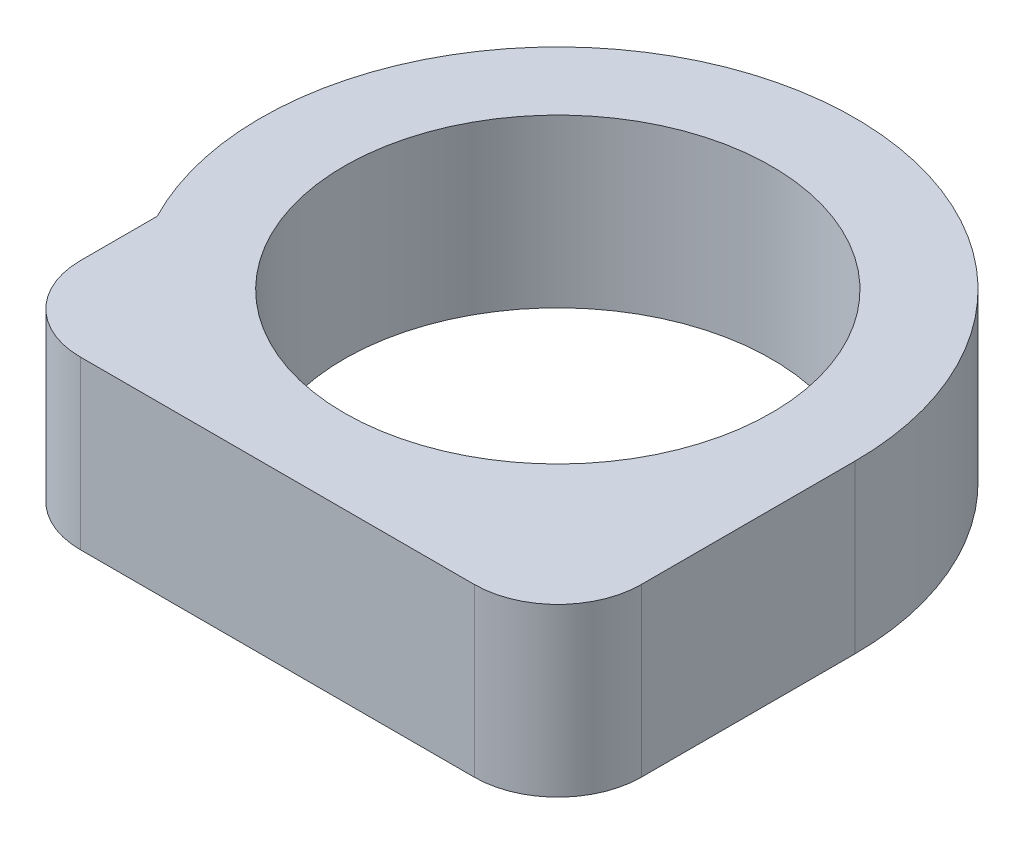
ISO-10303-21;
HEADER;
FILE_DESCRIPTION(('STEP AP214'),'2;1');
FILE_NAME('part.step','',(''),(''),'','','');
FILE_SCHEMA(('AUTOMOTIVE_DESIGN { 1 0 10303 214 1 1 1 1 }'));
ENDSEC;
DATA;
#1=APPLICATION_CONTEXT('core data for automotive mechanical design processes');
#2=APPLICATION_PROTOCOL_DEFINITION('international standard','automotive_design',2000,#1);
#3=PRODUCT_CONTEXT('',#1,'mechanical');
#4=PRODUCT('Part','Part','',(#3));
#5=PRODUCT_RELATED_PRODUCT_CATEGORY('part','',(#4));
#6=PRODUCT_DEFINITION_FORMATION('','',#4);
#7=PRODUCT_DEFINITION_CONTEXT('part definition',#1,'design');
#8=PRODUCT_DEFINITION('design','',#6,#7);
#9=PRODUCT_DEFINITION_SHAPE('','',#8);
#10=(LENGTH_UNIT() NAMED_UNIT(*) SI_UNIT(.MILLI.,.METRE.));
#11=(NAMED_UNIT(*) PLANE_ANGLE_UNIT() SI_UNIT($,.RADIAN.));
#12=(NAMED_UNIT(*) SI_UNIT($,.STERADIAN.) SOLID_ANGLE_UNIT());
#13=UNCERTAINTY_MEASURE_WITH_UNIT(LENGTH_MEASURE(1.E-05),#10,'distance_accuracy_value','');
#14=(GEOMETRIC_REPRESENTATION_CONTEXT(3) GLOBAL_UNCERTAINTY_ASSIGNED_CONTEXT((#13)) GLOBAL_UNIT_ASSIGNED_CONTEXT((#10,
#11,#12)) REPRESENTATION_CONTEXT('',''));
#15=CARTESIAN_POINT('',(0.,0.,0.));
#16=DIRECTION('',(0.,0.,1.));
#17=DIRECTION('',(1.,0.,0.));
#18=AXIS2_PLACEMENT_3D('',#15,#16,#17);
#19=CARTESIAN_POINT('',(-2.71253870759835,10.,-1.61598050665433));
#20=DIRECTION('',(0.,-1.,0.));
#21=DIRECTION('',(0.,0.,-1.));
#22=AXIS2_PLACEMENT_3D('',#19,#20,#21);
#23=CYLINDRICAL_SURFACE('',#22,17.8);
#24=CARTESIAN_POINT('',(-2.71253870759835,0.,-1.61598050665433));
#25=DIRECTION('',(0.,1.,0.));
#26=DIRECTION('',(0.,0.,1.));
#27=AXIS2_PLACEMENT_3D('',#24,#25,#26);
#28=CIRCLE('',#27,17.8);
#29=CARTESIAN_POINT('',(15.0874612924017,0.,-1.61598050665433));
#30=VERTEX_POINT('',#29);
#31=CARTESIAN_POINT('',(-18.5125387075984,0.,6.58158010611334));
#32=VERTEX_POINT('',#31);
#33=EDGE_CURVE('E109',#30,#32,#28,.T.);
#34=ORIENTED_EDGE('',*,*,#33,.T.);
#35=DIRECTION('',(0.,-1.,0.));
#36=VECTOR('',#35,1.);
#37=CARTESIAN_POINT('',(-18.5125387075984,10.,6.58158010611334));
#38=LINE('',#37,#36);
#39=CARTESIAN_POINT('',(-18.5125387075984,10.,6.58158010611334));
#40=VERTEX_POINT('',#39);
#41=EDGE_CURVE('E95',#40,#32,#38,.T.);
#42=ORIENTED_EDGE('',*,*,#41,.F.);
#43=CARTESIAN_POINT('',(-2.71253870759835,10.,-1.61598050665433));
#44=DIRECTION('',(0.,1.,0.));
#45=DIRECTION('',(0.,0.,1.));
#46=AXIS2_PLACEMENT_3D('',#43,#44,#45);
#47=CIRCLE('',#46,17.8);
#48=CARTESIAN_POINT('',(15.0874612924017,10.,-1.61598050665433));
#49=VERTEX_POINT('',#48);
#50=EDGE_CURVE('E99',#49,#40,#47,.T.);
#51=ORIENTED_EDGE('',*,*,#50,.F.);
#52=DIRECTION('',(0.,-1.,0.));
#53=VECTOR('',#52,1.);
#54=CARTESIAN_POINT('',(15.0874612924017,10.,-1.61598050665433));
#55=LINE('',#54,#53);
#56=EDGE_CURVE('E111',#49,#30,#55,.T.);
#57=ORIENTED_EDGE('',*,*,#56,.T.);
#58=EDGE_LOOP('',(#34,#42,#51,#57));
#59=FACE_BOUND('',#58,.T.);
#60=ADVANCED_FACE('F37',(#59),#23,.T.);
#61=CARTESIAN_POINT('',(-18.5125387075984,10.,0.));
#62=DIRECTION('',(1.,0.,0.));
#63=DIRECTION('',(0.,0.,-1.));
#64=AXIS2_PLACEMENT_3D('',#61,#62,#63);
#65=PLANE('',#64);
#66=DIRECTION('',(0.,0.,1.));
#67=VECTOR('',#66,1.);
#68=CARTESIAN_POINT('',(-18.5125387075984,0.,0.));
#69=LINE('',#68,#67);
#70=CARTESIAN_POINT('',(-18.5125387075983,0.,11.1840194933457));
#71=VERTEX_POINT('',#70);
#72=EDGE_CURVE('E139',#32,#71,#69,.T.);
#73=ORIENTED_EDGE('',*,*,#72,.T.);
#74=DIRECTION('',(0.,-1.,0.));
#75=VECTOR('',#74,1.);
#76=CARTESIAN_POINT('',(-18.5125387075983,10.,11.1840194933457));
#77=LINE('',#76,#75);
#78=CARTESIAN_POINT('',(-18.5125387075983,10.,11.1840194933457));
#79=VERTEX_POINT('',#78);
#80=EDGE_CURVE('E60',#71,#79,#77,.F.);
#81=ORIENTED_EDGE('',*,*,#80,.T.);
#82=DIRECTION('',(0.,0.,1.));
#83=VECTOR('',#82,1.);
#84=CARTESIAN_POINT('',(-18.5125387075984,10.,0.));
#85=LINE('',#84,#83);
#86=EDGE_CURVE('E91',#40,#79,#85,.T.);
#87=ORIENTED_EDGE('',*,*,#86,.F.);
#88=ORIENTED_EDGE('',*,*,#41,.T.);
#89=EDGE_LOOP('',(#73,#81,#87,#88));
#90=FACE_BOUND('',#89,.T.);
#91=ADVANCED_FACE('F93',(#90),#65,.F.);
#92=CARTESIAN_POINT('',(0.,10.,16.1840194933457));
#93=DIRECTION('',(0.,0.,-1.));
#94=DIRECTION('',(-1.,0.,0.));
#95=AXIS2_PLACEMENT_3D('',#92,#93,#94);
#96=PLANE('',#95);
#97=DIRECTION('',(1.,0.,0.));
#98=VECTOR('',#97,1.);
#99=CARTESIAN_POINT('',(0.,10.,16.1840194933457));
#100=LINE('',#99,#98);
#101=CARTESIAN_POINT('',(-13.5125387075984,10.,16.1840194933457));
#102=VERTEX_POINT('',#101);
#103=CARTESIAN_POINT('',(10.0874612924016,10.,16.1840194933457));
#104=VERTEX_POINT('',#103);
#105=EDGE_CURVE('E98',#102,#104,#100,.T.);
#106=ORIENTED_EDGE('',*,*,#105,.F.);
#107=DIRECTION('',(0.,-1.,0.));
#108=VECTOR('',#107,1.);
#109=CARTESIAN_POINT('',(-13.5125387075984,10.,16.1840194933457));
#110=LINE('',#109,#108);
#111=CARTESIAN_POINT('',(-13.5125387075984,0.,16.1840194933457));
#112=VERTEX_POINT('',#111);
#113=EDGE_CURVE('E113',#102,#112,#110,.T.);
#114=ORIENTED_EDGE('',*,*,#113,.T.);
#115=DIRECTION('',(1.,0.,0.));
#116=VECTOR('',#115,1.);
#117=CARTESIAN_POINT('',(0.,0.,16.1840194933457));
#118=LINE('',#117,#116);
#119=CARTESIAN_POINT('',(10.0874612924016,0.,16.1840194933457));
#120=VERTEX_POINT('',#119);
#121=EDGE_CURVE('E140',#112,#120,#118,.T.);
#122=ORIENTED_EDGE('',*,*,#121,.T.);
#123=DIRECTION('',(0.,-1.,0.));
#124=VECTOR('',#123,1.);
#125=CARTESIAN_POINT('',(10.0874612924016,10.,16.1840194933457));
#126=LINE('',#125,#124);
#127=EDGE_CURVE('E110',#120,#104,#126,.F.);
#128=ORIENTED_EDGE('',*,*,#127,.T.);
#129=EDGE_LOOP('',(#106,#114,#122,#128));
#130=FACE_BOUND('',#129,.T.);
#131=ADVANCED_FACE('F130',(#130),#96,.F.);
#132=CARTESIAN_POINT('',(15.0874612924017,10.,0.));
#133=DIRECTION('',(1.,0.,0.));
#134=DIRECTION('',(0.,0.,-1.));
#135=AXIS2_PLACEMENT_3D('',#132,#133,#134);
#136=PLANE('',#135);
#137=DIRECTION('',(0.,0.,1.));
#138=VECTOR('',#137,1.);
#139=CARTESIAN_POINT('',(15.0874612924017,10.,0.));
#140=LINE('',#139,#138);
#141=CARTESIAN_POINT('',(15.0874612924016,10.,11.1840194933457));
#142=VERTEX_POINT('',#141);
#143=EDGE_CURVE('E104',#49,#142,#140,.T.);
#144=ORIENTED_EDGE('',*,*,#143,.T.);
#145=DIRECTION('',(0.,-1.,0.));
#146=VECTOR('',#145,1.);
#147=CARTESIAN_POINT('',(15.0874612924016,0.,11.1840194933457));
#148=LINE('',#147,#146);
#149=CARTESIAN_POINT('',(15.0874612924016,0.,11.1840194933457));
#150=VERTEX_POINT('',#149);
#151=EDGE_CURVE('E11',#142,#150,#148,.T.);
#152=ORIENTED_EDGE('',*,*,#151,.T.);
#153=DIRECTION('',(0.,0.,1.));
#154=VECTOR('',#153,1.);
#155=CARTESIAN_POINT('',(15.0874612924017,0.,0.));
#156=LINE('',#155,#154);
#157=EDGE_CURVE('E142',#30,#150,#156,.T.);
#158=ORIENTED_EDGE('',*,*,#157,.F.);
#159=ORIENTED_EDGE('',*,*,#56,.F.);
#160=EDGE_LOOP('',(#144,#152,#158,#159));
#161=FACE_BOUND('',#160,.T.);
#162=ADVANCED_FACE('F153',(#161),#136,.T.);
#163=CARTESIAN_POINT('',(-2.71253870759835,10.,-1.61598050665433));
#164=DIRECTION('',(0.,-1.,0.));
#165=DIRECTION('',(0.,0.,-1.));
#166=AXIS2_PLACEMENT_3D('',#163,#164,#165);
#167=CYLINDRICAL_SURFACE('',#166,12.8);
#168=CARTESIAN_POINT('',(-2.71253870759835,10.,-1.61598050665433));
#169=DIRECTION('',(0.,1.,0.));
#170=DIRECTION('',(0.,0.,1.));
#171=AXIS2_PLACEMENT_3D('',#168,#169,#170);
#172=CIRCLE('',#171,12.8);
#173=CARTESIAN_POINT('',(-2.71253870759835,10.,11.1840194933457));
#174=VERTEX_POINT('',#173);
#175=EDGE_CURVE('E115',#174,#174,#172,.T.);
#176=ORIENTED_EDGE('',*,*,#175,.T.);
#177=EDGE_LOOP('',(#176));
#178=FACE_BOUND('',#177,.T.);
#179=CARTESIAN_POINT('',(-2.71253870759835,0.,-1.61598050665433));
#180=DIRECTION('',(0.,1.,0.));
#181=DIRECTION('',(0.,0.,1.));
#182=AXIS2_PLACEMENT_3D('',#179,#180,#181);
#183=CIRCLE('',#182,12.8);
#184=CARTESIAN_POINT('',(-2.71253870759835,0.,11.1840194933457));
#185=VERTEX_POINT('',#184);
#186=EDGE_CURVE('E106',#185,#185,#183,.T.);
#187=ORIENTED_EDGE('',*,*,#186,.F.);
#188=EDGE_LOOP('',(#187));
#189=FACE_BOUND('',#188,.T.);
#190=ADVANCED_FACE('F151',(#178,#189),#167,.F.);
#191=CARTESIAN_POINT('',(0.,10.,0.));
#192=DIRECTION('',(0.,1.,0.));
#193=DIRECTION('',(0.,0.,1.));
#194=AXIS2_PLACEMENT_3D('',#191,#192,#193);
#195=PLANE('',#194);
#196=ORIENTED_EDGE('',*,*,#86,.T.);
#197=CARTESIAN_POINT('',(-13.5125387075984,10.,11.1840194933457));
#198=DIRECTION('',(0.,1.,0.));
#199=DIRECTION('',(0.,0.,1.));
#200=AXIS2_PLACEMENT_3D('',#197,#198,#199);
#201=CIRCLE('',#200,5.);
#202=EDGE_CURVE('E45',#79,#102,#201,.T.);
#203=ORIENTED_EDGE('',*,*,#202,.T.);
#204=ORIENTED_EDGE('',*,*,#105,.T.);
#205=CARTESIAN_POINT('',(10.0874612924016,10.,11.1840194933457));
#206=DIRECTION('',(0.,1.,0.));
#207=DIRECTION('',(0.,0.,1.));
#208=AXIS2_PLACEMENT_3D('',#205,#206,#207);
#209=CIRCLE('',#208,5.);
#210=EDGE_CURVE('E52',#104,#142,#209,.T.);
#211=ORIENTED_EDGE('',*,*,#210,.T.);
#212=ORIENTED_EDGE('',*,*,#143,.F.);
#213=ORIENTED_EDGE('',*,*,#50,.T.);
#214=EDGE_LOOP('',(#196,#203,#204,#211,#212,#213));
#215=FACE_BOUND('',#214,.T.);
#216=ORIENTED_EDGE('',*,*,#175,.F.);
#217=EDGE_LOOP('',(#216));
#218=FACE_BOUND('',#217,.T.);
#219=ADVANCED_FACE('F102',(#215,#218),#195,.T.);
#220=CARTESIAN_POINT('',(0.,0.,0.));
#221=DIRECTION('',(0.,1.,0.));
#222=DIRECTION('',(0.,0.,1.));
#223=AXIS2_PLACEMENT_3D('',#220,#221,#222);
#224=PLANE('',#223);
#225=ORIENTED_EDGE('',*,*,#121,.F.);
#226=CARTESIAN_POINT('',(-13.5125387075984,0.,11.1840194933457));
#227=DIRECTION('',(0.,1.,0.));
#228=DIRECTION('',(0.,0.,1.));
#229=AXIS2_PLACEMENT_3D('',#226,#227,#228);
#230=CIRCLE('',#229,5.);
#231=EDGE_CURVE('E123',#112,#71,#230,.F.);
#232=ORIENTED_EDGE('',*,*,#231,.T.);
#233=ORIENTED_EDGE('',*,*,#72,.F.);
#234=ORIENTED_EDGE('',*,*,#33,.F.);
#235=ORIENTED_EDGE('',*,*,#157,.T.);
#236=CARTESIAN_POINT('',(10.0874612924016,0.,11.1840194933457));
#237=DIRECTION('',(0.,1.,0.));
#238=DIRECTION('',(0.,0.,1.));
#239=AXIS2_PLACEMENT_3D('',#236,#237,#238);
#240=CIRCLE('',#239,5.);
#241=EDGE_CURVE('E121',#150,#120,#240,.F.);
#242=ORIENTED_EDGE('',*,*,#241,.T.);
#243=EDGE_LOOP('',(#225,#232,#233,#234,#235,#242));
#244=FACE_BOUND('',#243,.T.);
#245=ORIENTED_EDGE('',*,*,#186,.T.);
#246=EDGE_LOOP('',(#245));
#247=FACE_BOUND('',#246,.T.);
#248=ADVANCED_FACE('F137',(#244,#247),#224,.F.);
#249=CARTESIAN_POINT('',(-13.5125387075984,10.,11.1840194933457));
#250=DIRECTION('',(0.,-1.,0.));
#251=DIRECTION('',(0.,0.,-1.));
#252=AXIS2_PLACEMENT_3D('',#249,#250,#251);
#253=CYLINDRICAL_SURFACE('',#252,5.);
#254=ORIENTED_EDGE('',*,*,#202,.F.);
#255=ORIENTED_EDGE('',*,*,#80,.F.);
#256=ORIENTED_EDGE('',*,*,#231,.F.);
#257=ORIENTED_EDGE('',*,*,#113,.F.);
#258=EDGE_LOOP('',(#254,#255,#256,#257));
#259=FACE_BOUND('',#258,.T.);
#260=ADVANCED_FACE('F135',(#259),#253,.T.);
#261=CARTESIAN_POINT('',(10.0874612924016,10.,11.1840194933457));
#262=DIRECTION('',(0.,1.,0.));
#263=DIRECTION('',(0.,0.,1.));
#264=AXIS2_PLACEMENT_3D('',#261,#262,#263);
#265=CYLINDRICAL_SURFACE('',#264,5.);
#266=ORIENTED_EDGE('',*,*,#210,.F.);
#267=ORIENTED_EDGE('',*,*,#127,.F.);
#268=ORIENTED_EDGE('',*,*,#241,.F.);
#269=ORIENTED_EDGE('',*,*,#151,.F.);
#270=EDGE_LOOP('',(#266,#267,#268,#269));
#271=FACE_BOUND('',#270,.T.);
#272=ADVANCED_FACE('F39',(#271),#265,.T.);
#273=CLOSED_SHELL('',(#60,#91,#131,#162,#190,#219,#248,#260,#272));
#274=MANIFOLD_SOLID_BREP('B2',#273);
#275=ADVANCED_BREP_SHAPE_REPRESENTATION('',(#18,#274),#14);
#276=SHAPE_DEFINITION_REPRESENTATION(#9,#275);
ENDSEC;
END-ISO-10303-21;
